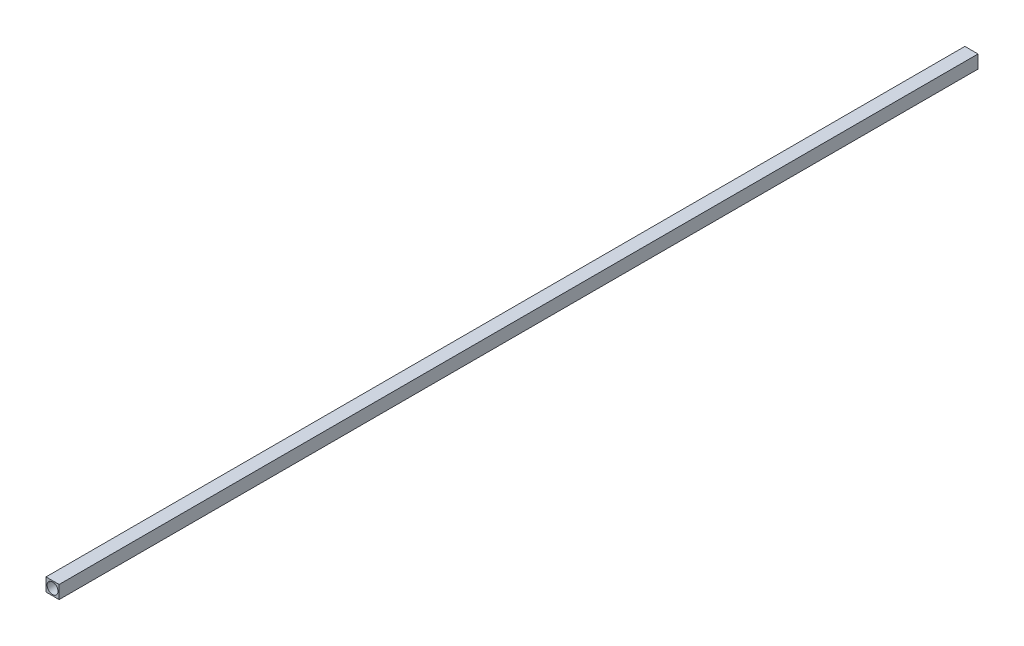
ISO-10303-21;
HEADER;
FILE_DESCRIPTION(('STEP AP214'),'2;1');
FILE_NAME('part.step','',(''),(''),'','','');
FILE_SCHEMA(('AUTOMOTIVE_DESIGN { 1 0 10303 214 1 1 1 1 }'));
ENDSEC;
DATA;
#1=APPLICATION_CONTEXT('core data for automotive mechanical design processes');
#2=APPLICATION_PROTOCOL_DEFINITION('international standard','automotive_design',2000,#1);
#3=PRODUCT_CONTEXT('',#1,'mechanical');
#4=PRODUCT('Part','Part','',(#3));
#5=PRODUCT_RELATED_PRODUCT_CATEGORY('part','',(#4));
#6=PRODUCT_DEFINITION_FORMATION('','',#4);
#7=PRODUCT_DEFINITION_CONTEXT('part definition',#1,'design');
#8=PRODUCT_DEFINITION('design','',#6,#7);
#9=PRODUCT_DEFINITION_SHAPE('','',#8);
#10=(LENGTH_UNIT() NAMED_UNIT(*) SI_UNIT(.MILLI.,.METRE.));
#11=(NAMED_UNIT(*) PLANE_ANGLE_UNIT() SI_UNIT($,.RADIAN.));
#12=(NAMED_UNIT(*) SI_UNIT($,.STERADIAN.) SOLID_ANGLE_UNIT());
#13=UNCERTAINTY_MEASURE_WITH_UNIT(LENGTH_MEASURE(1.E-05),#10,'distance_accuracy_value','');
#14=(GEOMETRIC_REPRESENTATION_CONTEXT(3) GLOBAL_UNCERTAINTY_ASSIGNED_CONTEXT((#13)) GLOBAL_UNIT_ASSIGNED_CONTEXT((#10,
#11,#12)) REPRESENTATION_CONTEXT('',''));
#15=CARTESIAN_POINT('',(0.,0.,0.));
#16=DIRECTION('',(0.,0.,1.));
#17=DIRECTION('',(1.,0.,0.));
#18=AXIS2_PLACEMENT_3D('',#15,#16,#17);
#19=CARTESIAN_POINT('',(0.,0.,420.));
#20=DIRECTION('',(0.,0.,-1.));
#21=DIRECTION('',(-1.,0.,0.));
#22=AXIS2_PLACEMENT_3D('',#19,#20,#21);
#23=PLANE('',#22);
#24=DIRECTION('',(0.,-1.,0.));
#25=VECTOR('',#24,1.);
#26=CARTESIAN_POINT('',(0.,0.,420.));
#27=LINE('',#26,#25);
#28=CARTESIAN_POINT('',(0.,6.,420.));
#29=VERTEX_POINT('',#28);
#30=CARTESIAN_POINT('',(0.,0.,420.));
#31=VERTEX_POINT('',#30);
#32=EDGE_CURVE('E98',#29,#31,#27,.T.);
#33=ORIENTED_EDGE('',*,*,#32,.T.);
#34=DIRECTION('',(1.,0.,0.));
#35=VECTOR('',#34,1.);
#36=CARTESIAN_POINT('',(0.,0.,420.));
#37=LINE('',#36,#35);
#38=CARTESIAN_POINT('',(6.,0.,420.));
#39=VERTEX_POINT('',#38);
#40=EDGE_CURVE('E93',#31,#39,#37,.T.);
#41=ORIENTED_EDGE('',*,*,#40,.T.);
#42=DIRECTION('',(0.,1.,0.));
#43=VECTOR('',#42,1.);
#44=CARTESIAN_POINT('',(6.,0.,420.));
#45=LINE('',#44,#43);
#46=CARTESIAN_POINT('',(6.,6.,420.));
#47=VERTEX_POINT('',#46);
#48=EDGE_CURVE('E96',#39,#47,#45,.T.);
#49=ORIENTED_EDGE('',*,*,#48,.T.);
#50=DIRECTION('',(-1.,0.,0.));
#51=VECTOR('',#50,1.);
#52=CARTESIAN_POINT('',(0.,6.,420.));
#53=LINE('',#52,#51);
#54=EDGE_CURVE('E63',#47,#29,#53,.T.);
#55=ORIENTED_EDGE('',*,*,#54,.T.);
#56=EDGE_LOOP('',(#33,#41,#49,#55));
#57=FACE_BOUND('',#56,.T.);
#58=CARTESIAN_POINT('',(3.,3.,420.));
#59=DIRECTION('',(0.,0.,1.));
#60=DIRECTION('',(1.,0.,0.));
#61=AXIS2_PLACEMENT_3D('',#58,#59,#60);
#62=CIRCLE('',#61,2.5);
#63=CARTESIAN_POINT('',(5.5,3.,420.));
#64=VERTEX_POINT('',#63);
#65=EDGE_CURVE('E118',#64,#64,#62,.T.);
#66=ORIENTED_EDGE('',*,*,#65,.F.);
#67=EDGE_LOOP('',(#66));
#68=FACE_BOUND('',#67,.T.);
#69=ADVANCED_FACE('F45',(#57,#68),#23,.F.);
#70=CARTESIAN_POINT('',(0.,0.,0.));
#71=DIRECTION('',(0.,0.,-1.));
#72=DIRECTION('',(-1.,0.,0.));
#73=AXIS2_PLACEMENT_3D('',#70,#71,#72);
#74=PLANE('',#73);
#75=DIRECTION('',(0.,-1.,0.));
#76=VECTOR('',#75,1.);
#77=CARTESIAN_POINT('',(0.,0.,0.));
#78=LINE('',#77,#76);
#79=CARTESIAN_POINT('',(0.,6.,0.));
#80=VERTEX_POINT('',#79);
#81=CARTESIAN_POINT('',(0.,0.,0.));
#82=VERTEX_POINT('',#81);
#83=EDGE_CURVE('E114',#80,#82,#78,.T.);
#84=ORIENTED_EDGE('',*,*,#83,.F.);
#85=DIRECTION('',(-1.,0.,0.));
#86=VECTOR('',#85,1.);
#87=CARTESIAN_POINT('',(0.,6.,0.));
#88=LINE('',#87,#86);
#89=CARTESIAN_POINT('',(6.,6.,0.));
#90=VERTEX_POINT('',#89);
#91=EDGE_CURVE('E86',#90,#80,#88,.T.);
#92=ORIENTED_EDGE('',*,*,#91,.F.);
#93=DIRECTION('',(0.,1.,0.));
#94=VECTOR('',#93,1.);
#95=CARTESIAN_POINT('',(6.,0.,0.));
#96=LINE('',#95,#94);
#97=CARTESIAN_POINT('',(6.,0.,0.));
#98=VERTEX_POINT('',#97);
#99=EDGE_CURVE('E80',#98,#90,#96,.T.);
#100=ORIENTED_EDGE('',*,*,#99,.F.);
#101=DIRECTION('',(1.,0.,0.));
#102=VECTOR('',#101,1.);
#103=CARTESIAN_POINT('',(0.,0.,0.));
#104=LINE('',#103,#102);
#105=EDGE_CURVE('E103',#82,#98,#104,.T.);
#106=ORIENTED_EDGE('',*,*,#105,.F.);
#107=EDGE_LOOP('',(#84,#92,#100,#106));
#108=FACE_BOUND('',#107,.T.);
#109=CARTESIAN_POINT('',(3.,3.,0.));
#110=DIRECTION('',(0.,0.,1.));
#111=DIRECTION('',(1.,0.,0.));
#112=AXIS2_PLACEMENT_3D('',#109,#110,#111);
#113=CIRCLE('',#112,2.5);
#114=CARTESIAN_POINT('',(5.5,3.,0.));
#115=VERTEX_POINT('',#114);
#116=EDGE_CURVE('E136',#115,#115,#113,.T.);
#117=ORIENTED_EDGE('',*,*,#116,.T.);
#118=EDGE_LOOP('',(#117));
#119=FACE_BOUND('',#118,.T.);
#120=ADVANCED_FACE('F131',(#108,#119),#74,.T.);
#121=CARTESIAN_POINT('',(0.,0.,420.));
#122=DIRECTION('',(1.,0.,0.));
#123=DIRECTION('',(0.,0.,-1.));
#124=AXIS2_PLACEMENT_3D('',#121,#122,#123);
#125=PLANE('',#124);
#126=ORIENTED_EDGE('',*,*,#83,.T.);
#127=DIRECTION('',(0.,0.,-1.));
#128=VECTOR('',#127,1.);
#129=CARTESIAN_POINT('',(0.,0.,420.));
#130=LINE('',#129,#128);
#131=EDGE_CURVE('E11',#31,#82,#130,.T.);
#132=ORIENTED_EDGE('',*,*,#131,.F.);
#133=ORIENTED_EDGE('',*,*,#32,.F.);
#134=DIRECTION('',(0.,0.,-1.));
#135=VECTOR('',#134,1.);
#136=CARTESIAN_POINT('',(0.,6.,420.));
#137=LINE('',#136,#135);
#138=EDGE_CURVE('E110',#29,#80,#137,.T.);
#139=ORIENTED_EDGE('',*,*,#138,.T.);
#140=EDGE_LOOP('',(#126,#132,#133,#139));
#141=FACE_BOUND('',#140,.T.);
#142=ADVANCED_FACE('F47',(#141),#125,.F.);
#143=CARTESIAN_POINT('',(0.,0.,420.));
#144=DIRECTION('',(0.,1.,0.));
#145=DIRECTION('',(0.,0.,1.));
#146=AXIS2_PLACEMENT_3D('',#143,#144,#145);
#147=PLANE('',#146);
#148=ORIENTED_EDGE('',*,*,#105,.T.);
#149=DIRECTION('',(0.,0.,-1.));
#150=VECTOR('',#149,1.);
#151=CARTESIAN_POINT('',(6.,0.,420.));
#152=LINE('',#151,#150);
#153=EDGE_CURVE('E55',#39,#98,#152,.T.);
#154=ORIENTED_EDGE('',*,*,#153,.F.);
#155=ORIENTED_EDGE('',*,*,#40,.F.);
#156=ORIENTED_EDGE('',*,*,#131,.T.);
#157=EDGE_LOOP('',(#148,#154,#155,#156));
#158=FACE_BOUND('',#157,.T.);
#159=ADVANCED_FACE('F102',(#158),#147,.F.);
#160=CARTESIAN_POINT('',(6.,0.,420.));
#161=DIRECTION('',(-1.,0.,0.));
#162=DIRECTION('',(0.,-1.,0.));
#163=AXIS2_PLACEMENT_3D('',#160,#161,#162);
#164=PLANE('',#163);
#165=ORIENTED_EDGE('',*,*,#99,.T.);
#166=DIRECTION('',(0.,0.,-1.));
#167=VECTOR('',#166,1.);
#168=CARTESIAN_POINT('',(6.,6.,420.));
#169=LINE('',#168,#167);
#170=EDGE_CURVE('E105',#47,#90,#169,.T.);
#171=ORIENTED_EDGE('',*,*,#170,.F.);
#172=ORIENTED_EDGE('',*,*,#48,.F.);
#173=ORIENTED_EDGE('',*,*,#153,.T.);
#174=EDGE_LOOP('',(#165,#171,#172,#173));
#175=FACE_BOUND('',#174,.T.);
#176=ADVANCED_FACE('F106',(#175),#164,.F.);
#177=CARTESIAN_POINT('',(0.,6.,420.));
#178=DIRECTION('',(0.,-1.,0.));
#179=DIRECTION('',(0.,0.,-1.));
#180=AXIS2_PLACEMENT_3D('',#177,#178,#179);
#181=PLANE('',#180);
#182=ORIENTED_EDGE('',*,*,#91,.T.);
#183=ORIENTED_EDGE('',*,*,#138,.F.);
#184=ORIENTED_EDGE('',*,*,#54,.F.);
#185=ORIENTED_EDGE('',*,*,#170,.T.);
#186=EDGE_LOOP('',(#182,#183,#184,#185));
#187=FACE_BOUND('',#186,.T.);
#188=ADVANCED_FACE('F128',(#187),#181,.F.);
#189=CARTESIAN_POINT('',(3.,3.,420.));
#190=DIRECTION('',(0.,0.,-1.));
#191=DIRECTION('',(-1.,0.,0.));
#192=AXIS2_PLACEMENT_3D('',#189,#190,#191);
#193=CYLINDRICAL_SURFACE('',#192,2.5);
#194=ORIENTED_EDGE('',*,*,#65,.T.);
#195=EDGE_LOOP('',(#194));
#196=FACE_BOUND('',#195,.T.);
#197=ORIENTED_EDGE('',*,*,#116,.F.);
#198=EDGE_LOOP('',(#197));
#199=FACE_BOUND('',#198,.T.);
#200=ADVANCED_FACE('F144',(#196,#199),#193,.F.);
#201=CLOSED_SHELL('',(#69,#120,#142,#159,#176,#188,#200));
#202=MANIFOLD_SOLID_BREP('B2',#201);
#203=ADVANCED_BREP_SHAPE_REPRESENTATION('',(#18,#202),#14);
#204=SHAPE_DEFINITION_REPRESENTATION(#9,#203);
ENDSEC;
END-ISO-10303-21;
